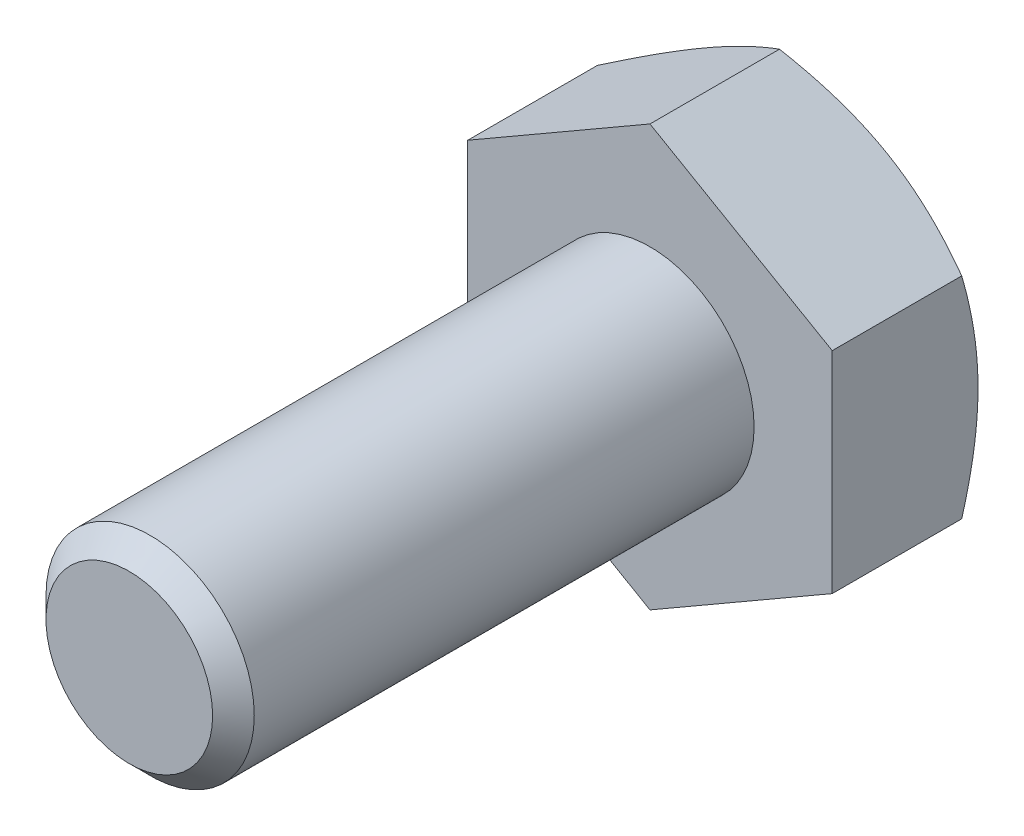
ISO-10303-21;
HEADER;
FILE_DESCRIPTION(('STEP AP214'),'2;1');
FILE_NAME('part.step','',(''),(''),'','','');
FILE_SCHEMA(('AUTOMOTIVE_DESIGN { 1 0 10303 214 1 1 1 1 }'));
ENDSEC;
DATA;
#1=APPLICATION_CONTEXT('core data for automotive mechanical design processes');
#2=APPLICATION_PROTOCOL_DEFINITION('international standard','automotive_design',2000,#1);
#3=PRODUCT_CONTEXT('',#1,'mechanical');
#4=PRODUCT('Part','Part','',(#3));
#5=PRODUCT_RELATED_PRODUCT_CATEGORY('part','',(#4));
#6=PRODUCT_DEFINITION_FORMATION('','',#4);
#7=PRODUCT_DEFINITION_CONTEXT('part definition',#1,'design');
#8=PRODUCT_DEFINITION('design','',#6,#7);
#9=PRODUCT_DEFINITION_SHAPE('','',#8);
#10=(LENGTH_UNIT() NAMED_UNIT(*) SI_UNIT(.MILLI.,.METRE.));
#11=(NAMED_UNIT(*) PLANE_ANGLE_UNIT() SI_UNIT($,.RADIAN.));
#12=(NAMED_UNIT(*) SI_UNIT($,.STERADIAN.) SOLID_ANGLE_UNIT());
#13=UNCERTAINTY_MEASURE_WITH_UNIT(LENGTH_MEASURE(1.E-05),#10,'distance_accuracy_value','');
#14=(GEOMETRIC_REPRESENTATION_CONTEXT(3) GLOBAL_UNCERTAINTY_ASSIGNED_CONTEXT((#13)) GLOBAL_UNIT_ASSIGNED_CONTEXT((#10,
#11,#12)) REPRESENTATION_CONTEXT('',''));
#15=CARTESIAN_POINT('',(0.,0.,0.));
#16=DIRECTION('',(0.,0.,1.));
#17=DIRECTION('',(1.,0.,0.));
#18=AXIS2_PLACEMENT_3D('',#15,#16,#17);
#19=CARTESIAN_POINT('',(0.,0.,10.));
#20=DIRECTION('',(0.,0.,1.));
#21=DIRECTION('',(1.,0.,0.));
#22=AXIS2_PLACEMENT_3D('',#19,#20,#21);
#23=PLANE('',#22);
#24=CARTESIAN_POINT('',(0.,0.,10.));
#25=DIRECTION('',(0.,0.,1.));
#26=DIRECTION('',(1.,0.,0.));
#27=AXIS2_PLACEMENT_3D('',#24,#25,#26);
#28=CIRCLE('',#27,1.6);
#29=CARTESIAN_POINT('',(1.6,0.,10.));
#30=VERTEX_POINT('',#29);
#31=EDGE_CURVE('E269',#30,#30,#28,.T.);
#32=ORIENTED_EDGE('',*,*,#31,.T.);
#33=EDGE_LOOP('',(#32));
#34=FACE_BOUND('',#33,.T.);
#35=ADVANCED_FACE('F32',(#34),#23,.T.);
#36=CARTESIAN_POINT('',(0.,0.,0.));
#37=DIRECTION('',(0.,0.,1.));
#38=DIRECTION('',(1.,0.,0.));
#39=AXIS2_PLACEMENT_3D('',#36,#37,#38);
#40=CYLINDRICAL_SURFACE('',#39,2.);
#41=CARTESIAN_POINT('',(0.,0.,9.6));
#42=DIRECTION('',(0.,0.,1.));
#43=DIRECTION('',(1.,0.,0.));
#44=AXIS2_PLACEMENT_3D('',#41,#42,#43);
#45=CIRCLE('',#44,2.);
#46=CARTESIAN_POINT('',(2.,0.,9.6));
#47=VERTEX_POINT('',#46);
#48=EDGE_CURVE('E240',#47,#47,#45,.F.);
#49=ORIENTED_EDGE('',*,*,#48,.T.);
#50=EDGE_LOOP('',(#49));
#51=FACE_BOUND('',#50,.T.);
#52=CARTESIAN_POINT('',(0.,0.,0.));
#53=DIRECTION('',(0.,0.,1.));
#54=DIRECTION('',(1.,0.,0.));
#55=AXIS2_PLACEMENT_3D('',#52,#53,#54);
#56=CIRCLE('',#55,2.);
#57=CARTESIAN_POINT('',(2.,0.,0.));
#58=VERTEX_POINT('',#57);
#59=EDGE_CURVE('E266',#58,#58,#56,.F.);
#60=ORIENTED_EDGE('',*,*,#59,.F.);
#61=EDGE_LOOP('',(#60));
#62=FACE_BOUND('',#61,.T.);
#63=ADVANCED_FACE('F204',(#51,#62),#40,.T.);
#64=CARTESIAN_POINT('',(0.,0.,10.));
#65=DIRECTION('',(0.,0.,-1.));
#66=DIRECTION('',(-1.,0.,0.));
#67=AXIS2_PLACEMENT_3D('',#64,#65,#66);
#68=CONICAL_SURFACE('',#67,1.6,0.785398163397446);
#69=ORIENTED_EDGE('',*,*,#48,.F.);
#70=EDGE_LOOP('',(#69));
#71=FACE_BOUND('',#70,.T.);
#72=ORIENTED_EDGE('',*,*,#31,.F.);
#73=EDGE_LOOP('',(#72));
#74=FACE_BOUND('',#73,.T.);
#75=ADVANCED_FACE('F34',(#71,#74),#68,.T.);
#76=CARTESIAN_POINT('',(0.,4.04145188432739,-2.8));
#77=DIRECTION('',(0.499999999999998,0.86602540378444,0.));
#78=DIRECTION('',(-0.86602540378444,0.499999999999998,0.));
#79=AXIS2_PLACEMENT_3D('',#76,#77,#78);
#80=PLANE('',#79);
#81=CARTESIAN_POINT('',(-0.000200000000018282,4.04156735438123,-2.48732593930663));
#82=CARTESIAN_POINT('',(0.153607178452432,3.95276673849841,-2.53861421101001));
#83=CARTESIAN_POINT('',(0.308742010834407,3.86319960126199,-2.5852590461838));
#84=CARTESIAN_POINT('',(0.621698006576765,3.68251437287563,-2.66667812446665));
#85=CARTESIAN_POINT('',(0.779524730787481,3.59139307116726,-2.70142356441544));
#86=CARTESIAN_POINT('',(1.09322221038011,3.41027974688035,-2.75550997281716));
#87=CARTESIAN_POINT('',(1.24904469916068,3.32031559103709,-2.77521091373962));
#88=CARTESIAN_POINT('',(1.56142288720536,3.13996396008053,-2.79872986726275));
#89=CARTESIAN_POINT('',(1.71797745103422,3.04957714051107,-2.80256735545444));
#90=CARTESIAN_POINT('',(2.01050921992098,2.88068384499778,-2.79458469812302));
#91=CARTESIAN_POINT('',(2.1465302124579,2.80215208834115,-2.78472456593039));
#92=CARTESIAN_POINT('',(2.41768602028899,2.64560020969754,-2.7534735331006));
#93=CARTESIAN_POINT('',(2.55281989768468,2.56758062920651,-2.7320719567142));
#94=CARTESIAN_POINT('',(2.82453479240518,2.41070596159679,-2.67856959211942));
#95=CARTESIAN_POINT('',(2.96108141927833,2.33187072981464,-2.64624200555491));
#96=CARTESIAN_POINT('',(3.2321380929445,2.17537608630784,-2.57287106619201));
#97=CARTESIAN_POINT('',(3.36665161246854,2.09771466960099,-2.53184495343013));
#98=CARTESIAN_POINT('',(3.5002,2.02061047210986,-2.48732593930663));
#99=B_SPLINE_CURVE_WITH_KNOTS('',3,(#81,#82,#83,#84,#85,#86,#87,#88,#89,#90,#91,#92,#93,#94,#95,
#96,#97,#98),.UNSPECIFIED.,.F.,.F.,(4,2,2,2,2,2,2,2,4),(0.,0.554793832886255,1.11092123814984,
1.65328467083219,2.19498204478404,2.66665130850861,3.13875761298269,3.62133612600511,
4.10296698719189),.UNSPECIFIED.);
#100=CARTESIAN_POINT('',(0.,4.04145188432739,-2.48739260883035));
#101=VERTEX_POINT('',#100);
#102=CARTESIAN_POINT('',(1.74999999999999,3.03108891324554,-2.8));
#103=VERTEX_POINT('',#102);
#104=EDGE_CURVE('E228',#101,#103,#99,.T.);
#105=ORIENTED_EDGE('',*,*,#104,.F.);
#106=DIRECTION('',(0.,0.,1.));
#107=VECTOR('',#106,1.);
#108=CARTESIAN_POINT('',(0.,4.04145188432739,-2.8));
#109=LINE('',#108,#107);
#110=CARTESIAN_POINT('',(0.,4.04145188432739,0.));
#111=VERTEX_POINT('',#110);
#112=EDGE_CURVE('E225',#101,#111,#109,.T.);
#113=ORIENTED_EDGE('',*,*,#112,.T.);
#114=DIRECTION('',(-0.86602540378444,0.499999999999998,0.));
#115=VECTOR('',#114,1.);
#116=CARTESIAN_POINT('',(0.,4.04145188432739,0.));
#117=LINE('',#116,#115);
#118=CARTESIAN_POINT('',(3.5,2.0207259421637,0.));
#119=VERTEX_POINT('',#118);
#120=EDGE_CURVE('E233',#119,#111,#117,.T.);
#121=ORIENTED_EDGE('',*,*,#120,.F.);
#122=DIRECTION('',(0.,0.,1.));
#123=VECTOR('',#122,1.);
#124=CARTESIAN_POINT('',(3.5,2.0207259421637,-2.8));
#125=LINE('',#124,#123);
#126=CARTESIAN_POINT('',(3.5,2.0207259421637,-2.48739260883035));
#127=VERTEX_POINT('',#126);
#128=EDGE_CURVE('E258',#127,#119,#125,.T.);
#129=ORIENTED_EDGE('',*,*,#128,.F.);
#130=EDGE_CURVE('E177',#103,#127,#99,.T.);
#131=ORIENTED_EDGE('',*,*,#130,.F.);
#132=EDGE_LOOP('',(#105,#113,#121,#129,#131));
#133=FACE_BOUND('',#132,.T.);
#134=ADVANCED_FACE('F188',(#133),#80,.T.);
#135=CARTESIAN_POINT('',(3.5,-2.0207259421637,-2.8));
#136=DIRECTION('',(1.,0.,0.));
#137=DIRECTION('',(0.,0.,-1.));
#138=AXIS2_PLACEMENT_3D('',#135,#136,#137);
#139=PLANE('',#138);
#140=CARTESIAN_POINT('',(3.5,-5.5115599132137,-1.05123027842014));
#141=CARTESIAN_POINT('',(3.5,-5.35795146168121,-1.12607664094827));
#142=CARTESIAN_POINT('',(3.5,-5.20399921009229,-1.20022907517413));
#143=CARTESIAN_POINT('',(3.5,-4.89522454872942,-1.34675734914902));
#144=CARTESIAN_POINT('',(3.5,-4.74040201352888,-1.41913292430435));
#145=CARTESIAN_POINT('',(3.5,-4.42894615034129,-1.56206506717812));
#146=CARTESIAN_POINT('',(3.5,-4.27230759822603,-1.63261028917771));
#147=CARTESIAN_POINT('',(3.5,-3.95781335182267,-1.77092284895817));
#148=CARTESIAN_POINT('',(3.5,-3.79995771311103,-1.83869031269911));
#149=CARTESIAN_POINT('',(3.5,-3.47741113153966,-1.97295074269912));
#150=CARTESIAN_POINT('',(3.5,-3.31266966015408,-2.03932296039635));
#151=CARTESIAN_POINT('',(3.5,-2.98129055183975,-2.16724360933954));
#152=CARTESIAN_POINT('',(3.5,-2.81465270912935,-2.22879151125521));
#153=CARTESIAN_POINT('',(3.5,-2.47950135030689,-2.34550906477687));
#154=CARTESIAN_POINT('',(3.5,-2.31099212862996,-2.40069092778852));
#155=CARTESIAN_POINT('',(3.5,-1.9715578800388,-2.50296137699356));
#156=CARTESIAN_POINT('',(3.5,-1.80063360505408,-2.55005242468974));
#157=CARTESIAN_POINT('',(3.5,-1.45721769418154,-2.63368726814516));
#158=CARTESIAN_POINT('',(3.5,-1.284740691287,-2.67029006719255));
#159=CARTESIAN_POINT('',(3.5,-0.937557025087316,-2.73093355614778));
#160=CARTESIAN_POINT('',(3.5,-0.762850606367499,-2.75497561213941));
#161=CARTESIAN_POINT('',(3.5,-0.41439625684188,-2.78826920086828));
#162=CARTESIAN_POINT('',(3.5,-0.24066759256781,-2.79771739417793));
#163=CARTESIAN_POINT('',(3.5,0.106974360360036,-2.80154556659445));
#164=CARTESIAN_POINT('',(3.5,0.280887651698044,-2.7959253235422));
#165=CARTESIAN_POINT('',(3.5,0.57367772999446,-2.77418399451728));
#166=CARTESIAN_POINT('',(3.5,0.692856453275199,-2.76187051371579));
#167=CARTESIAN_POINT('',(3.5,0.930390570440087,-2.73088957270953));
#168=CARTESIAN_POINT('',(3.5,1.04874585973469,-2.71222131985519));
#169=CARTESIAN_POINT('',(3.5,1.40238821087656,-2.64766060469304));
#170=CARTESIAN_POINT('',(3.5,1.636135180366,-2.59322203585637));
#171=CARTESIAN_POINT('',(3.5,1.98584040729011,-2.49818174698124));
#172=CARTESIAN_POINT('',(3.5,2.10359260573205,-2.46379952268766));
#173=CARTESIAN_POINT('',(3.5,2.3379545290403,-2.39130577472369));
#174=CARTESIAN_POINT('',(3.5,2.45456424508592,-2.35319422228545));
#175=CARTESIAN_POINT('',(3.5,2.68667648503228,-2.27386649986118));
#176=CARTESIAN_POINT('',(3.5,2.80217931014601,-2.23265120318029));
#177=CARTESIAN_POINT('',(3.5,3.0322162217769,-2.14761668191578));
#178=CARTESIAN_POINT('',(3.5,3.14675033047978,-2.10379751715191));
#179=CARTESIAN_POINT('',(3.5,3.45518824474215,-1.98241358076653));
#180=CARTESIAN_POINT('',(3.5,3.64827858337665,-1.90278371704724));
#181=CARTESIAN_POINT('',(3.5,4.03246733734996,-1.738838783469));
#182=CARTESIAN_POINT('',(3.5,4.22356552793095,-1.6545231916082));
#183=CARTESIAN_POINT('',(3.5,4.60422080078615,-1.48231977624898));
#184=CARTESIAN_POINT('',(3.5,4.79377731975278,-1.3944307117281));
#185=CARTESIAN_POINT('',(3.5,5.17160542987793,-1.21592705795529));
#186=CARTESIAN_POINT('',(3.5,5.35987698121651,-1.12531238470558));
#187=CARTESIAN_POINT('',(3.5,5.73567568183911,-0.941812491523437));
#188=CARTESIAN_POINT('',(3.5,5.92320119040395,-0.848923918398865));
#189=CARTESIAN_POINT('',(3.5,6.29740401332882,-0.661451949679656));
#190=CARTESIAN_POINT('',(3.5,6.4840813186156,-0.566868536008528));
#191=CARTESIAN_POINT('',(3.5,7.04299370579127,-0.281137350976761));
#192=CARTESIAN_POINT('',(3.5,7.41419418594083,-0.0879667587069206));
#193=CARTESIAN_POINT('',(3.5,8.1154529737333,0.28131090771229));
#194=CARTESIAN_POINT('',(3.5,8.44570240603792,0.457056799003233));
#195=CARTESIAN_POINT('',(3.5,9.10509095269334,0.810667080198443));
#196=CARTESIAN_POINT('',(3.5,9.4342299968145,0.988531600993423));
#197=CARTESIAN_POINT('',(3.5,10.0905480448887,1.34522643131465));
#198=CARTESIAN_POINT('',(3.5,10.4177299168719,1.52405147197681));
#199=CARTESIAN_POINT('',(3.5,11.0714005801046,1.88290305302714));
#200=CARTESIAN_POINT('',(3.5,11.397889424295,2.06292949694077));
#201=CARTESIAN_POINT('',(3.5,11.7241348717818,2.24339321716844));
#202=B_SPLINE_CURVE_WITH_KNOTS('',3,(#140,#141,#142,#143,#144,#145,#146,#147,#148,#149,#150,
#151,#152,#153,#154,#155,#156,#157,#158,#159,#160,#161,#162,#163,#164,#165,#166,#167,#168,#169,
#170,#171,#172,#173,#174,#175,#176,#177,#178,#179,#180,#181,#182,#183,#184,#185,#186,#187,#188,
#189,#190,#191,#192,#193,#194,#195,#196,#197,#198,#199,#200,#201),.UNSPECIFIED.,.F.,.F.,(4,2,2,
2,2,2,2,2,2,2,2,2,2,2,2,2,2,2,2,2,2,2,2,2,2,2,2,2,2,2,4),(0.,0.512624455055139,1.02532478807014,
1.54067716579031,2.05600614845994,2.58877526662743,3.12160275933497,3.65339055670451,
4.18501627844404,4.71358974605645,5.24210571499797,5.76343550148058,6.28477297414903,
6.64403977227188,7.00335139923845,7.72232402023062,8.09029789782061,8.45827461416728,
8.82614817645966,9.19401329070559,9.82051720102626,10.4470910459092,11.0738843824793,
11.7006970553932,12.3284975462801,12.9563047370264,14.2116350789245,15.333929259245,
16.4562931392235,17.5748776783279,18.6933734490332),.UNSPECIFIED.);
#203=CARTESIAN_POINT('',(3.5,0.,-2.8));
#204=VERTEX_POINT('',#203);
#205=EDGE_CURVE('E175',#127,#204,#202,.F.);
#206=ORIENTED_EDGE('',*,*,#205,.F.);
#207=ORIENTED_EDGE('',*,*,#128,.T.);
#208=DIRECTION('',(0.,1.,0.));
#209=VECTOR('',#208,1.);
#210=CARTESIAN_POINT('',(3.5,-2.0207259421637,0.));
#211=LINE('',#210,#209);
#212=CARTESIAN_POINT('',(3.5,-2.0207259421637,0.));
#213=VERTEX_POINT('',#212);
#214=EDGE_CURVE('E265',#213,#119,#211,.T.);
#215=ORIENTED_EDGE('',*,*,#214,.F.);
#216=DIRECTION('',(0.,0.,1.));
#217=VECTOR('',#216,1.);
#218=CARTESIAN_POINT('',(3.5,-2.0207259421637,-2.8));
#219=LINE('',#218,#217);
#220=CARTESIAN_POINT('',(3.5,-2.0207259421637,-2.48739260883036));
#221=VERTEX_POINT('',#220);
#222=EDGE_CURVE('E243',#221,#213,#219,.T.);
#223=ORIENTED_EDGE('',*,*,#222,.F.);
#224=EDGE_CURVE('E169',#204,#221,#202,.F.);
#225=ORIENTED_EDGE('',*,*,#224,.F.);
#226=EDGE_LOOP('',(#206,#207,#215,#223,#225));
#227=FACE_BOUND('',#226,.T.);
#228=ADVANCED_FACE('F184',(#227),#139,.T.);
#229=CARTESIAN_POINT('',(0.,-4.04145188432739,-2.8));
#230=DIRECTION('',(0.499999999999998,-0.86602540378444,0.));
#231=DIRECTION('',(0.86602540378444,0.499999999999998,0.));
#232=AXIS2_PLACEMENT_3D('',#229,#230,#231);
#233=PLANE('',#232);
#234=CARTESIAN_POINT('',(3.5002,-2.02061047210986,-2.48732593930663));
#235=CARTESIAN_POINT('',(3.34639282154755,-2.10941108799268,-2.53861421101002));
#236=CARTESIAN_POINT('',(3.19125798916558,-2.1989782252291,-2.5852590461838));
#237=CARTESIAN_POINT('',(2.87830199342322,-2.37966345361546,-2.66667812446665));
#238=CARTESIAN_POINT('',(2.7204752692125,-2.47078475532383,-2.70142356441544));
#239=CARTESIAN_POINT('',(2.40677778961987,-2.65189807961074,-2.75550997281716));
#240=CARTESIAN_POINT('',(2.25095530083931,-2.741862235454,-2.77521091373962));
#241=CARTESIAN_POINT('',(1.93857711279462,-2.92221386641056,-2.79872986726275));
#242=CARTESIAN_POINT('',(1.78202254896577,-3.01260068598002,-2.80256735545444));
#243=CARTESIAN_POINT('',(1.48949078007901,-3.1814939814933,-2.79458469812302));
#244=CARTESIAN_POINT('',(1.35346978754209,-3.26002573814993,-2.78472456593039));
#245=CARTESIAN_POINT('',(1.082313979711,-3.41657761679354,-2.7534735331006));
#246=CARTESIAN_POINT('',(0.947180102315307,-3.49459719728458,-2.7320719567142));
#247=CARTESIAN_POINT('',(0.675465207594804,-3.65147186489429,-2.67856959211942));
#248=CARTESIAN_POINT('',(0.538918580721651,-3.73030709667644,-2.64624200555491));
#249=CARTESIAN_POINT('',(0.267861907055482,-3.88680174018325,-2.572871066192));
#250=CARTESIAN_POINT('',(0.133348387531446,-3.9644631568901,-2.53184495343013));
#251=CARTESIAN_POINT('',(-0.00020000000001818,-4.04156735438123,-2.48732593930663));
#252=B_SPLINE_CURVE_WITH_KNOTS('',3,(#234,#235,#236,#237,#238,#239,#240,#241,#242,#243,#244,
#245,#246,#247,#248,#249,#250,#251),.UNSPECIFIED.,.F.,.F.,(4,2,2,2,2,2,2,2,4),(0.,
0.554793832886255,1.11092123814984,1.65328467083219,2.19498204478404,2.66665130850861,
3.13875761298269,3.62133612600511,4.10296698719189),.UNSPECIFIED.);
#253=CARTESIAN_POINT('',(1.74999999999999,-3.03108891324554,-2.8));
#254=VERTEX_POINT('',#253);
#255=EDGE_CURVE('E176',#221,#254,#252,.T.);
#256=ORIENTED_EDGE('',*,*,#255,.F.);
#257=ORIENTED_EDGE('',*,*,#222,.T.);
#258=DIRECTION('',(0.86602540378444,0.499999999999998,0.));
#259=VECTOR('',#258,1.);
#260=CARTESIAN_POINT('',(0.,-4.04145188432739,0.));
#261=LINE('',#260,#259);
#262=CARTESIAN_POINT('',(0.,-4.04145188432739,0.));
#263=VERTEX_POINT('',#262);
#264=EDGE_CURVE('E254',#263,#213,#261,.T.);
#265=ORIENTED_EDGE('',*,*,#264,.F.);
#266=DIRECTION('',(0.,0.,1.));
#267=VECTOR('',#266,1.);
#268=CARTESIAN_POINT('',(0.,-4.04145188432739,-2.8));
#269=LINE('',#268,#267);
#270=CARTESIAN_POINT('',(0.,-4.04145188432739,-2.48739260883035));
#271=VERTEX_POINT('',#270);
#272=EDGE_CURVE('E253',#271,#263,#269,.T.);
#273=ORIENTED_EDGE('',*,*,#272,.F.);
#274=EDGE_CURVE('E162',#254,#271,#252,.T.);
#275=ORIENTED_EDGE('',*,*,#274,.F.);
#276=EDGE_LOOP('',(#256,#257,#265,#273,#275));
#277=FACE_BOUND('',#276,.T.);
#278=ADVANCED_FACE('F187',(#277),#233,.T.);
#279=CARTESIAN_POINT('',(0.,-4.04145188432739,-2.8));
#280=DIRECTION('',(-0.500000000000002,-0.866025403784438,0.));
#281=DIRECTION('',(0.866025403784438,-0.500000000000002,0.));
#282=AXIS2_PLACEMENT_3D('',#279,#280,#281);
#283=PLANE('',#282);
#284=CARTESIAN_POINT('',(0.000199999999981852,-4.04156735438123,-2.48732593930663));
#285=CARTESIAN_POINT('',(-0.153607178452468,-3.95276673849841,-2.53861421101001));
#286=CARTESIAN_POINT('',(-0.308742010834443,-3.86319960126199,-2.5852590461838));
#287=CARTESIAN_POINT('',(-0.621698006576801,-3.68251437287563,-2.66667812446665));
#288=CARTESIAN_POINT('',(-0.779524730787515,-3.59139307116725,-2.70142356441544));
#289=CARTESIAN_POINT('',(-1.09322221038015,-3.41027974688034,-2.75550997281716));
#290=CARTESIAN_POINT('',(-1.24904469916071,-3.32031559103708,-2.77521091373962));
#291=CARTESIAN_POINT('',(-1.56142288720539,-3.13996396008052,-2.79872986726274));
#292=CARTESIAN_POINT('',(-1.71797745103425,-3.04957714051106,-2.80256735545443));
#293=CARTESIAN_POINT('',(-2.01050921992101,-2.88068384499777,-2.79458469812302));
#294=CARTESIAN_POINT('',(-2.14653021245793,-2.80215208834115,-2.78472456593039));
#295=CARTESIAN_POINT('',(-2.41768602028901,-2.64560020969754,-2.75347353310059));
#296=CARTESIAN_POINT('',(-2.5528198976847,-2.5675806292065,-2.7320719567142));
#297=CARTESIAN_POINT('',(-2.8245347924052,-2.41070596159679,-2.67856959211942));
#298=CARTESIAN_POINT('',(-2.96108141927835,-2.33187072981464,-2.64624200555491));
#299=CARTESIAN_POINT('',(-3.23213809294451,-2.17537608630784,-2.572871066192));
#300=CARTESIAN_POINT('',(-3.36665161246854,-2.09771466960099,-2.53184495343013));
#301=CARTESIAN_POINT('',(-3.5002,-2.02061047210986,-2.48732593930663));
#302=B_SPLINE_CURVE_WITH_KNOTS('',3,(#284,#285,#286,#287,#288,#289,#290,#291,#292,#293,#294,
#295,#296,#297,#298,#299,#300,#301),.UNSPECIFIED.,.F.,.F.,(4,2,2,2,2,2,2,2,4),(0.,
0.554793832886255,1.11092123814984,1.65328467083219,2.19498204478404,2.6666513085086,
3.13875761298267,3.62133612600509,4.10296698719186),.UNSPECIFIED.);
#303=CARTESIAN_POINT('',(-1.75000000000001,-3.03108891324553,-2.8));
#304=VERTEX_POINT('',#303);
#305=EDGE_CURVE('E249',#271,#304,#302,.T.);
#306=ORIENTED_EDGE('',*,*,#305,.F.);
#307=ORIENTED_EDGE('',*,*,#272,.T.);
#308=DIRECTION('',(0.866025403784438,-0.500000000000002,0.));
#309=VECTOR('',#308,1.);
#310=CARTESIAN_POINT('',(0.,-4.04145188432739,0.));
#311=LINE('',#310,#309);
#312=CARTESIAN_POINT('',(-3.5,-2.0207259421637,0.));
#313=VERTEX_POINT('',#312);
#314=EDGE_CURVE('E387',#313,#263,#311,.T.);
#315=ORIENTED_EDGE('',*,*,#314,.F.);
#316=DIRECTION('',(0.,0.,1.));
#317=VECTOR('',#316,1.);
#318=CARTESIAN_POINT('',(-3.5,-2.0207259421637,-2.8));
#319=LINE('',#318,#317);
#320=CARTESIAN_POINT('',(-3.5,-2.02072594216386,-2.48739260883046));
#321=VERTEX_POINT('',#320);
#322=EDGE_CURVE('E256',#321,#313,#319,.T.);
#323=ORIENTED_EDGE('',*,*,#322,.F.);
#324=EDGE_CURVE('E109',#304,#321,#302,.T.);
#325=ORIENTED_EDGE('',*,*,#324,.F.);
#326=EDGE_LOOP('',(#306,#307,#315,#323,#325));
#327=FACE_BOUND('',#326,.T.);
#328=ADVANCED_FACE('F193',(#327),#283,.T.);
#329=CARTESIAN_POINT('',(-3.5,-2.0207259421637,-2.8));
#330=DIRECTION('',(-1.,0.,0.));
#331=DIRECTION('',(0.,0.,1.));
#332=AXIS2_PLACEMENT_3D('',#329,#330,#331);
#333=PLANE('',#332);
#334=CARTESIAN_POINT('',(-3.5,-5.5115599132137,-1.05123027842014));
#335=CARTESIAN_POINT('',(-3.5,-5.35795146168121,-1.12607664094827));
#336=CARTESIAN_POINT('',(-3.5,-5.20399921009229,-1.20022907517413));
#337=CARTESIAN_POINT('',(-3.5,-4.89522454872942,-1.34675734914902));
#338=CARTESIAN_POINT('',(-3.5,-4.74040201352888,-1.41913292430435));
#339=CARTESIAN_POINT('',(-3.5,-4.42894615034129,-1.56206506717813));
#340=CARTESIAN_POINT('',(-3.5,-4.27230759822603,-1.63261028917771));
#341=CARTESIAN_POINT('',(-3.5,-3.95781335182267,-1.77092284895817));
#342=CARTESIAN_POINT('',(-3.5,-3.79995771311103,-1.83869031269911));
#343=CARTESIAN_POINT('',(-3.5,-3.47741113153966,-1.97295074269912));
#344=CARTESIAN_POINT('',(-3.5,-3.31266966015408,-2.03932296039635));
#345=CARTESIAN_POINT('',(-3.5,-2.98129055183975,-2.16724360933954));
#346=CARTESIAN_POINT('',(-3.5,-2.81465270912935,-2.22879151125521));
#347=CARTESIAN_POINT('',(-3.5,-2.47950135030689,-2.34550906477687));
#348=CARTESIAN_POINT('',(-3.5,-2.31099212862996,-2.40069092778851));
#349=CARTESIAN_POINT('',(-3.5,-1.9715578800388,-2.50296137699356));
#350=CARTESIAN_POINT('',(-3.5,-1.80063360505408,-2.55005242468974));
#351=CARTESIAN_POINT('',(-3.5,-1.45721769418154,-2.63368726814516));
#352=CARTESIAN_POINT('',(-3.5,-1.284740691287,-2.67029006719254));
#353=CARTESIAN_POINT('',(-3.5,-0.937557025087316,-2.73093355614778));
#354=CARTESIAN_POINT('',(-3.5,-0.7628506063675,-2.75497561213941));
#355=CARTESIAN_POINT('',(-3.5,-0.41439625684188,-2.78826920086828));
#356=CARTESIAN_POINT('',(-3.5,-0.240667592567811,-2.79771739417793));
#357=CARTESIAN_POINT('',(-3.5,0.106974360360035,-2.80154556659445));
#358=CARTESIAN_POINT('',(-3.5,0.280887651698044,-2.7959253235422));
#359=CARTESIAN_POINT('',(-3.5,0.573677729994459,-2.77418399451728));
#360=CARTESIAN_POINT('',(-3.5,0.692856453275198,-2.76187051371579));
#361=CARTESIAN_POINT('',(-3.5,0.930390570440087,-2.73088957270953));
#362=CARTESIAN_POINT('',(-3.5,1.04874585973469,-2.71222131985519));
#363=CARTESIAN_POINT('',(-3.5,1.40238821087656,-2.64766060469304));
#364=CARTESIAN_POINT('',(-3.5,1.636135180366,-2.59322203585637));
#365=CARTESIAN_POINT('',(-3.5,1.98584040729011,-2.49818174698124));
#366=CARTESIAN_POINT('',(-3.5,2.10359260573205,-2.46379952268766));
#367=CARTESIAN_POINT('',(-3.5,2.3379545290403,-2.39130577472369));
#368=CARTESIAN_POINT('',(-3.5,2.45456424508592,-2.35319422228545));
#369=CARTESIAN_POINT('',(-3.5,2.68667648503228,-2.27386649986119));
#370=CARTESIAN_POINT('',(-3.5,2.80217931014601,-2.23265120318029));
#371=CARTESIAN_POINT('',(-3.5,3.0322162217769,-2.14761668191579));
#372=CARTESIAN_POINT('',(-3.5,3.14675033047978,-2.10379751715191));
#373=CARTESIAN_POINT('',(-3.5,3.45518824474215,-1.98241358076653));
#374=CARTESIAN_POINT('',(-3.5,3.64827858337665,-1.90278371704724));
#375=CARTESIAN_POINT('',(-3.5,4.03246733734996,-1.738838783469));
#376=CARTESIAN_POINT('',(-3.5,4.22356552793095,-1.6545231916082));
#377=CARTESIAN_POINT('',(-3.5,4.60422080078615,-1.48231977624898));
#378=CARTESIAN_POINT('',(-3.5,4.79377731975278,-1.3944307117281));
#379=CARTESIAN_POINT('',(-3.5,5.17160542987793,-1.21592705795529));
#380=CARTESIAN_POINT('',(-3.5,5.3598769812165,-1.12531238470558));
#381=CARTESIAN_POINT('',(-3.5,5.7356756818391,-0.941812491523439));
#382=CARTESIAN_POINT('',(-3.5,5.92320119040394,-0.848923918398866));
#383=CARTESIAN_POINT('',(-3.5,6.29740401332881,-0.661451949679658));
#384=CARTESIAN_POINT('',(-3.5,6.4840813186156,-0.566868536008529));
#385=CARTESIAN_POINT('',(-3.5,7.04299370579126,-0.281137350976762));
#386=CARTESIAN_POINT('',(-3.5,7.41419418594082,-0.0879667587069218));
#387=CARTESIAN_POINT('',(-3.5,8.1154529737333,0.281310907712289));
#388=CARTESIAN_POINT('',(-3.5,8.44570240603792,0.457056799003232));
#389=CARTESIAN_POINT('',(-3.5,9.10509095269334,0.810667080198443));
#390=CARTESIAN_POINT('',(-3.5,9.4342299968145,0.988531600993422));
#391=CARTESIAN_POINT('',(-3.5,10.0905480448887,1.34522643131465));
#392=CARTESIAN_POINT('',(-3.5,10.4177299168718,1.52405147197681));
#393=CARTESIAN_POINT('',(-3.5,11.0714005801046,1.88290305302714));
#394=CARTESIAN_POINT('',(-3.5,11.397889424295,2.06292949694077));
#395=CARTESIAN_POINT('',(-3.5,11.7241348717818,2.24339321716844));
#396=B_SPLINE_CURVE_WITH_KNOTS('',3,(#334,#335,#336,#337,#338,#339,#340,#341,#342,#343,#344,
#345,#346,#347,#348,#349,#350,#351,#352,#353,#354,#355,#356,#357,#358,#359,#360,#361,#362,#363,
#364,#365,#366,#367,#368,#369,#370,#371,#372,#373,#374,#375,#376,#377,#378,#379,#380,#381,#382,
#383,#384,#385,#386,#387,#388,#389,#390,#391,#392,#393,#394,#395),.UNSPECIFIED.,.F.,.F.,(4,2,2,
2,2,2,2,2,2,2,2,2,2,2,2,2,2,2,2,2,2,2,2,2,2,2,2,2,2,2,4),(0.,0.51262445505514,1.02532478807014,
1.54067716579031,2.05600614845994,2.58877526662743,3.12160275933497,3.65339055670451,
4.18501627844404,4.71358974605645,5.24210571499797,5.76343550148057,6.28477297414903,
6.64403977227187,7.00335139923845,7.72232402023061,8.0902978978206,8.45827461416728,
8.82614817645965,9.19401329070559,9.82051720102626,10.4470910459092,11.0738843824793,
11.7006970553932,12.3284975462801,12.9563047370264,14.2116350789245,15.333929259245,
16.4562931392235,17.5748776783279,18.6933734490332),.UNSPECIFIED.);
#397=CARTESIAN_POINT('',(-3.5,0.,-2.8));
#398=VERTEX_POINT('',#397);
#399=EDGE_CURVE('E104',#321,#398,#396,.T.);
#400=ORIENTED_EDGE('',*,*,#399,.F.);
#401=ORIENTED_EDGE('',*,*,#322,.T.);
#402=DIRECTION('',(0.,-1.,0.));
#403=VECTOR('',#402,1.);
#404=CARTESIAN_POINT('',(-3.5,-2.0207259421637,0.));
#405=LINE('',#404,#403);
#406=CARTESIAN_POINT('',(-3.5,2.0207259421637,0.));
#407=VERTEX_POINT('',#406);
#408=EDGE_CURVE('E389',#407,#313,#405,.T.);
#409=ORIENTED_EDGE('',*,*,#408,.F.);
#410=DIRECTION('',(0.,0.,1.));
#411=VECTOR('',#410,1.);
#412=CARTESIAN_POINT('',(-3.5,2.0207259421637,-2.8));
#413=LINE('',#412,#411);
#414=CARTESIAN_POINT('',(-3.5,2.0207259421637,-2.48739260883035));
#415=VERTEX_POINT('',#414);
#416=EDGE_CURVE('E130',#415,#407,#413,.T.);
#417=ORIENTED_EDGE('',*,*,#416,.F.);
#418=EDGE_CURVE('E113',#398,#415,#396,.T.);
#419=ORIENTED_EDGE('',*,*,#418,.F.);
#420=EDGE_LOOP('',(#400,#401,#409,#417,#419));
#421=FACE_BOUND('',#420,.T.);
#422=ADVANCED_FACE('F128',(#421),#333,.T.);
#423=CARTESIAN_POINT('',(-3.5,2.0207259421637,-2.8));
#424=DIRECTION('',(-0.500000000000002,0.866025403784438,0.));
#425=DIRECTION('',(-0.866025403784438,-0.500000000000002,0.));
#426=AXIS2_PLACEMENT_3D('',#423,#424,#425);
#427=PLANE('',#426);
#428=CARTESIAN_POINT('',(-3.5002,2.02061047210986,-2.48732593930663));
#429=CARTESIAN_POINT('',(-3.34639282154755,2.10941108799268,-2.53861421101001));
#430=CARTESIAN_POINT('',(-3.19125798916558,2.1989782252291,-2.5852590461838));
#431=CARTESIAN_POINT('',(-2.87830199342322,2.37966345361546,-2.66667812446665));
#432=CARTESIAN_POINT('',(-2.72047526921251,2.47078475532383,-2.70142356441544));
#433=CARTESIAN_POINT('',(-2.40677778961987,2.65189807961075,-2.75550997281716));
#434=CARTESIAN_POINT('',(-2.25095530083931,2.741862235454,-2.77521091373962));
#435=CARTESIAN_POINT('',(-1.93857711279463,2.92221386641057,-2.79872986726274));
#436=CARTESIAN_POINT('',(-1.78202254896577,3.01260068598002,-2.80256735545443));
#437=CARTESIAN_POINT('',(-1.48949078007901,3.18149398149331,-2.79458469812302));
#438=CARTESIAN_POINT('',(-1.3534697875421,3.26002573814994,-2.78472456593039));
#439=CARTESIAN_POINT('',(-1.08231397971101,3.41657761679355,-2.75347353310059));
#440=CARTESIAN_POINT('',(-0.947180102315325,3.49459719728459,-2.7320719567142));
#441=CARTESIAN_POINT('',(-0.675465207594827,3.6514718648943,-2.67856959211942));
#442=CARTESIAN_POINT('',(-0.538918580721677,3.73030709667645,-2.64624200555491));
#443=CARTESIAN_POINT('',(-0.267861907055514,3.88680174018325,-2.572871066192));
#444=CARTESIAN_POINT('',(-0.13334838753148,3.9644631568901,-2.53184495343013));
#445=CARTESIAN_POINT('',(0.000199999999981511,4.04156735438123,-2.48732593930663));
#446=B_SPLINE_CURVE_WITH_KNOTS('',3,(#428,#429,#430,#431,#432,#433,#434,#435,#436,#437,#438,
#439,#440,#441,#442,#443,#444,#445),.UNSPECIFIED.,.F.,.F.,(4,2,2,2,2,2,2,2,4),(0.,
0.554793832886256,1.11092123814984,1.65328467083219,2.19498204478403,2.6666513085086,
3.13875761298267,3.62133612600509,4.10296698719186),.UNSPECIFIED.);
#447=CARTESIAN_POINT('',(-1.75000000000001,3.03108891324554,-2.8));
#448=VERTEX_POINT('',#447);
#449=EDGE_CURVE('E119',#415,#448,#446,.T.);
#450=ORIENTED_EDGE('',*,*,#449,.F.);
#451=ORIENTED_EDGE('',*,*,#416,.T.);
#452=DIRECTION('',(-0.866025403784438,-0.500000000000002,0.));
#453=VECTOR('',#452,1.);
#454=CARTESIAN_POINT('',(-3.5,2.0207259421637,0.));
#455=LINE('',#454,#453);
#456=EDGE_CURVE('E235',#111,#407,#455,.T.);
#457=ORIENTED_EDGE('',*,*,#456,.F.);
#458=ORIENTED_EDGE('',*,*,#112,.F.);
#459=EDGE_CURVE('E121',#448,#101,#446,.T.);
#460=ORIENTED_EDGE('',*,*,#459,.F.);
#461=EDGE_LOOP('',(#450,#451,#457,#458,#460));
#462=FACE_BOUND('',#461,.T.);
#463=ADVANCED_FACE('F201',(#462),#427,.T.);
#464=CARTESIAN_POINT('',(3.5,2.0207259421637,0.));
#465=DIRECTION('',(0.,0.,1.));
#466=DIRECTION('',(1.,0.,0.));
#467=AXIS2_PLACEMENT_3D('',#464,#465,#466);
#468=PLANE('',#467);
#469=ORIENTED_EDGE('',*,*,#59,.T.);
#470=EDGE_LOOP('',(#469));
#471=FACE_BOUND('',#470,.T.);
#472=ORIENTED_EDGE('',*,*,#120,.T.);
#473=ORIENTED_EDGE('',*,*,#456,.T.);
#474=ORIENTED_EDGE('',*,*,#408,.T.);
#475=ORIENTED_EDGE('',*,*,#314,.T.);
#476=ORIENTED_EDGE('',*,*,#264,.T.);
#477=ORIENTED_EDGE('',*,*,#214,.T.);
#478=EDGE_LOOP('',(#472,#473,#474,#475,#476,#477));
#479=FACE_BOUND('',#478,.T.);
#480=ADVANCED_FACE('F190',(#471,#479),#468,.T.);
#481=CARTESIAN_POINT('',(0.,0.,0.));
#482=DIRECTION('',(0.,0.,1.));
#483=DIRECTION('',(1.,0.,0.));
#484=AXIS2_PLACEMENT_3D('',#481,#482,#483);
#485=CONICAL_SURFACE('',#484,8.34974226119285,1.0471975511966);
#486=ORIENTED_EDGE('',*,*,#130,.T.);
#487=ORIENTED_EDGE('',*,*,#205,.T.);
#488=CARTESIAN_POINT('',(0.,0.,-2.8));
#489=DIRECTION('',(0.,0.,1.));
#490=DIRECTION('',(1.,0.,0.));
#491=AXIS2_PLACEMENT_3D('',#488,#489,#490);
#492=CIRCLE('',#491,3.5);
#493=EDGE_CURVE('E36',#103,#204,#492,.F.);
#494=ORIENTED_EDGE('',*,*,#493,.F.);
#495=EDGE_LOOP('',(#486,#487,#494));
#496=FACE_BOUND('',#495,.T.);
#497=ADVANCED_FACE('F221',(#496),#485,.T.);
#498=ORIENTED_EDGE('',*,*,#104,.T.);
#499=EDGE_CURVE('E126',#448,#103,#492,.F.);
#500=ORIENTED_EDGE('',*,*,#499,.F.);
#501=ORIENTED_EDGE('',*,*,#459,.T.);
#502=EDGE_LOOP('',(#498,#500,#501));
#503=FACE_BOUND('',#502,.T.);
#504=ADVANCED_FACE('F154',(#503),#485,.T.);
#505=ORIENTED_EDGE('',*,*,#418,.T.);
#506=ORIENTED_EDGE('',*,*,#449,.T.);
#507=CARTESIAN_POINT('',(0.,0.,-2.8));
#508=DIRECTION('',(0.,0.,-1.));
#509=DIRECTION('',(-1.,0.,0.));
#510=AXIS2_PLACEMENT_3D('',#507,#508,#509);
#511=CIRCLE('',#510,3.5);
#512=EDGE_CURVE('E54',#398,#448,#511,.T.);
#513=ORIENTED_EDGE('',*,*,#512,.F.);
#514=EDGE_LOOP('',(#505,#506,#513));
#515=FACE_BOUND('',#514,.T.);
#516=ADVANCED_FACE('F117',(#515),#485,.T.);
#517=ORIENTED_EDGE('',*,*,#324,.T.);
#518=ORIENTED_EDGE('',*,*,#399,.T.);
#519=EDGE_CURVE('E106',#304,#398,#492,.F.);
#520=ORIENTED_EDGE('',*,*,#519,.F.);
#521=EDGE_LOOP('',(#517,#518,#520));
#522=FACE_BOUND('',#521,.T.);
#523=ADVANCED_FACE('F105',(#522),#485,.T.);
#524=ORIENTED_EDGE('',*,*,#274,.T.);
#525=ORIENTED_EDGE('',*,*,#305,.T.);
#526=EDGE_CURVE('E41',#254,#304,#492,.F.);
#527=ORIENTED_EDGE('',*,*,#526,.F.);
#528=EDGE_LOOP('',(#524,#525,#527));
#529=FACE_BOUND('',#528,.T.);
#530=ADVANCED_FACE('F251',(#529),#485,.T.);
#531=ORIENTED_EDGE('',*,*,#224,.T.);
#532=ORIENTED_EDGE('',*,*,#255,.T.);
#533=EDGE_CURVE('E11',#204,#254,#492,.F.);
#534=ORIENTED_EDGE('',*,*,#533,.F.);
#535=EDGE_LOOP('',(#531,#532,#534));
#536=FACE_BOUND('',#535,.T.);
#537=ADVANCED_FACE('F245',(#536),#485,.T.);
#538=CARTESIAN_POINT('',(3.5,2.0207259421637,-2.8));
#539=DIRECTION('',(0.,0.,1.));
#540=DIRECTION('',(1.,0.,0.));
#541=AXIS2_PLACEMENT_3D('',#538,#539,#540);
#542=PLANE('',#541);
#543=ORIENTED_EDGE('',*,*,#493,.T.);
#544=ORIENTED_EDGE('',*,*,#533,.T.);
#545=ORIENTED_EDGE('',*,*,#526,.T.);
#546=ORIENTED_EDGE('',*,*,#519,.T.);
#547=ORIENTED_EDGE('',*,*,#512,.T.);
#548=ORIENTED_EDGE('',*,*,#499,.T.);
#549=EDGE_LOOP('',(#543,#544,#545,#546,#547,#548));
#550=FACE_BOUND('',#549,.T.);
#551=ADVANCED_FACE('F124',(#550),#542,.F.);
#552=CLOSED_SHELL('',(#35,#63,#75,#134,#228,#278,#328,#422,#463,#480,#497,#504,#516,#523,#530,
#537,#551));
#553=MANIFOLD_SOLID_BREP('B2',#552);
#554=ADVANCED_BREP_SHAPE_REPRESENTATION('',(#18,#553),#14);
#555=SHAPE_DEFINITION_REPRESENTATION(#9,#554);
ENDSEC;
END-ISO-10303-21;
